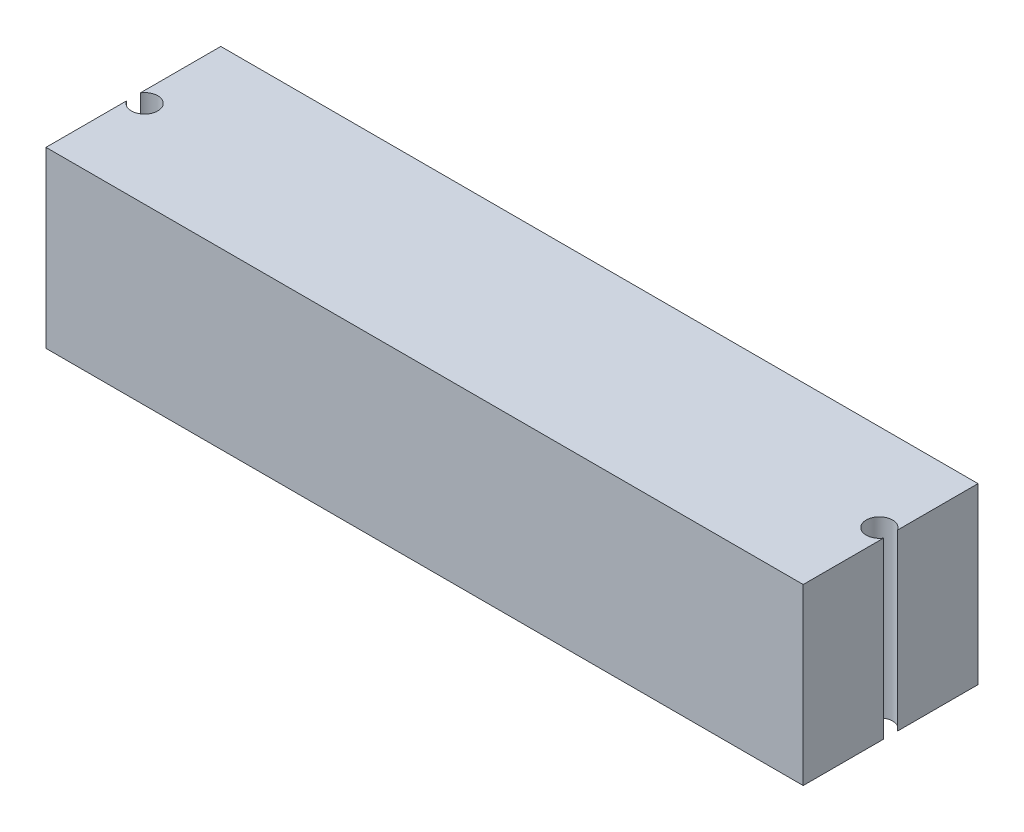
ISO-10303-21;
HEADER;
FILE_DESCRIPTION(('STEP AP214'),'2;1');
FILE_NAME('part.step','',(''),(''),'','','');
FILE_SCHEMA(('AUTOMOTIVE_DESIGN { 1 0 10303 214 1 1 1 1 }'));
ENDSEC;
DATA;
#1=APPLICATION_CONTEXT('core data for automotive mechanical design processes');
#2=APPLICATION_PROTOCOL_DEFINITION('international standard','automotive_design',2000,#1);
#3=PRODUCT_CONTEXT('',#1,'mechanical');
#4=PRODUCT('Part','Part','',(#3));
#5=PRODUCT_RELATED_PRODUCT_CATEGORY('part','',(#4));
#6=PRODUCT_DEFINITION_FORMATION('','',#4);
#7=PRODUCT_DEFINITION_CONTEXT('part definition',#1,'design');
#8=PRODUCT_DEFINITION('design','',#6,#7);
#9=PRODUCT_DEFINITION_SHAPE('','',#8);
#10=(LENGTH_UNIT() NAMED_UNIT(*) SI_UNIT(.MILLI.,.METRE.));
#11=(NAMED_UNIT(*) PLANE_ANGLE_UNIT() SI_UNIT($,.RADIAN.));
#12=(NAMED_UNIT(*) SI_UNIT($,.STERADIAN.) SOLID_ANGLE_UNIT());
#13=UNCERTAINTY_MEASURE_WITH_UNIT(LENGTH_MEASURE(1.E-05),#10,'distance_accuracy_value','');
#14=(GEOMETRIC_REPRESENTATION_CONTEXT(3) GLOBAL_UNCERTAINTY_ASSIGNED_CONTEXT((#13)) GLOBAL_UNIT_ASSIGNED_CONTEXT((#10,
#11,#12)) REPRESENTATION_CONTEXT('',''));
#15=CARTESIAN_POINT('',(0.,0.,0.));
#16=DIRECTION('',(0.,0.,1.));
#17=DIRECTION('',(1.,0.,0.));
#18=AXIS2_PLACEMENT_3D('',#15,#16,#17);
#19=CARTESIAN_POINT('',(-15.2432558748559,26.4,15.205418624234));
#20=DIRECTION('',(0.,0.,-1.));
#21=DIRECTION('',(-1.,0.,0.));
#22=AXIS2_PLACEMENT_3D('',#19,#20,#21);
#23=PLANE('',#22);
#24=DIRECTION('',(0.,1.,0.));
#25=VECTOR('',#24,1.);
#26=CARTESIAN_POINT('',(-14.7432558748559,26.4,15.205418624234));
#27=LINE('',#26,#25);
#28=CARTESIAN_POINT('',(-14.7432558748559,0.,15.205418624234));
#29=VERTEX_POINT('',#28);
#30=CARTESIAN_POINT('',(-14.7432558748559,26.4,15.205418624234));
#31=VERTEX_POINT('',#30);
#32=EDGE_CURVE('E124',#29,#31,#27,.T.);
#33=ORIENTED_EDGE('',*,*,#32,.F.);
#34=DIRECTION('',(1.,0.,0.));
#35=VECTOR('',#34,1.);
#36=CARTESIAN_POINT('',(-15.2432558748559,0.,15.205418624234));
#37=LINE('',#36,#35);
#38=CARTESIAN_POINT('',(100.056744125144,0.,15.205418624234));
#39=VERTEX_POINT('',#38);
#40=EDGE_CURVE('E130',#29,#39,#37,.T.);
#41=ORIENTED_EDGE('',*,*,#40,.T.);
#42=DIRECTION('',(0.,-1.,0.));
#43=VECTOR('',#42,1.);
#44=CARTESIAN_POINT('',(100.056744125144,0.,15.205418624234));
#45=LINE('',#44,#43);
#46=CARTESIAN_POINT('',(100.056744125144,26.4,15.205418624234));
#47=VERTEX_POINT('',#46);
#48=EDGE_CURVE('E169',#47,#39,#45,.T.);
#49=ORIENTED_EDGE('',*,*,#48,.F.);
#50=DIRECTION('',(1.,0.,0.));
#51=VECTOR('',#50,1.);
#52=CARTESIAN_POINT('',(-15.2432558748559,26.4,15.205418624234));
#53=LINE('',#52,#51);
#54=EDGE_CURVE('E127',#31,#47,#53,.T.);
#55=ORIENTED_EDGE('',*,*,#54,.F.);
#56=EDGE_LOOP('',(#33,#41,#49,#55));
#57=FACE_BOUND('',#56,.T.);
#58=ADVANCED_FACE('F41',(#57),#23,.F.);
#59=CARTESIAN_POINT('',(-15.2432558748559,26.4,-11.294581375766));
#60=DIRECTION('',(0.,0.,1.));
#61=DIRECTION('',(1.,0.,0.));
#62=AXIS2_PLACEMENT_3D('',#59,#60,#61);
#63=PLANE('',#62);
#64=DIRECTION('',(0.,-1.,0.));
#65=VECTOR('',#64,1.);
#66=CARTESIAN_POINT('',(-14.7432558748559,0.,-11.294581375766));
#67=LINE('',#66,#65);
#68=CARTESIAN_POINT('',(-14.7432558748559,26.4,-11.294581375766));
#69=VERTEX_POINT('',#68);
#70=CARTESIAN_POINT('',(-14.7432558748559,0.,-11.294581375766));
#71=VERTEX_POINT('',#70);
#72=EDGE_CURVE('E105',#69,#71,#67,.T.);
#73=ORIENTED_EDGE('',*,*,#72,.F.);
#74=DIRECTION('',(-1.,0.,0.));
#75=VECTOR('',#74,1.);
#76=CARTESIAN_POINT('',(-15.2432558748559,26.4,-11.294581375766));
#77=LINE('',#76,#75);
#78=CARTESIAN_POINT('',(100.056744125144,26.4,-11.294581375766));
#79=VERTEX_POINT('',#78);
#80=EDGE_CURVE('E129',#79,#69,#77,.T.);
#81=ORIENTED_EDGE('',*,*,#80,.F.);
#82=DIRECTION('',(0.,1.,0.));
#83=VECTOR('',#82,1.);
#84=CARTESIAN_POINT('',(100.056744125144,26.4,-11.294581375766));
#85=LINE('',#84,#83);
#86=CARTESIAN_POINT('',(100.056744125144,0.,-11.294581375766));
#87=VERTEX_POINT('',#86);
#88=EDGE_CURVE('E122',#87,#79,#85,.T.);
#89=ORIENTED_EDGE('',*,*,#88,.F.);
#90=DIRECTION('',(-1.,0.,0.));
#91=VECTOR('',#90,1.);
#92=CARTESIAN_POINT('',(-15.2432558748559,0.,-11.294581375766));
#93=LINE('',#92,#91);
#94=EDGE_CURVE('E119',#87,#71,#93,.T.);
#95=ORIENTED_EDGE('',*,*,#94,.T.);
#96=EDGE_LOOP('',(#73,#81,#89,#95));
#97=FACE_BOUND('',#96,.T.);
#98=ADVANCED_FACE('F123',(#97),#63,.F.);
#99=CARTESIAN_POINT('',(0.,0.,0.));
#100=DIRECTION('',(0.,1.,0.));
#101=DIRECTION('',(0.,0.,1.));
#102=AXIS2_PLACEMENT_3D('',#99,#100,#101);
#103=PLANE('',#102);
#104=DIRECTION('',(0.,0.,1.));
#105=VECTOR('',#104,1.);
#106=CARTESIAN_POINT('',(-14.7432558748559,0.,15.205418624234));
#107=LINE('',#106,#105);
#108=CARTESIAN_POINT('',(-14.7432558748559,0.,0.901853248948743));
#109=VERTEX_POINT('',#108);
#110=EDGE_CURVE('E65',#71,#109,#107,.T.);
#111=ORIENTED_EDGE('',*,*,#110,.F.);
#112=ORIENTED_EDGE('',*,*,#94,.F.);
#113=DIRECTION('',(0.,0.,-1.));
#114=VECTOR('',#113,1.);
#115=CARTESIAN_POINT('',(100.056744125144,0.,-11.294581375766));
#116=LINE('',#115,#114);
#117=CARTESIAN_POINT('',(100.056744125144,0.,0.90185324894876));
#118=VERTEX_POINT('',#117);
#119=EDGE_CURVE('E170',#118,#87,#116,.T.);
#120=ORIENTED_EDGE('',*,*,#119,.F.);
#121=CARTESIAN_POINT('',(98.3567441251441,0.,1.95541862423402));
#122=DIRECTION('',(0.,1.,0.));
#123=DIRECTION('',(0.,0.,1.));
#124=AXIS2_PLACEMENT_3D('',#121,#122,#123);
#125=CIRCLE('',#124,2.);
#126=CARTESIAN_POINT('',(100.056744125144,0.,3.00898399951927));
#127=VERTEX_POINT('',#126);
#128=EDGE_CURVE('E151',#118,#127,#125,.T.);
#129=ORIENTED_EDGE('',*,*,#128,.T.);
#130=EDGE_CURVE('E164',#39,#127,#116,.T.);
#131=ORIENTED_EDGE('',*,*,#130,.F.);
#132=ORIENTED_EDGE('',*,*,#40,.F.);
#133=CARTESIAN_POINT('',(-14.7432558748559,0.,3.00898399951929));
#134=VERTEX_POINT('',#133);
#135=EDGE_CURVE('E109',#134,#29,#107,.T.);
#136=ORIENTED_EDGE('',*,*,#135,.F.);
#137=CARTESIAN_POINT('',(-13.0432558748559,0.,1.95541862423402));
#138=DIRECTION('',(0.,1.,0.));
#139=DIRECTION('',(0.,0.,1.));
#140=AXIS2_PLACEMENT_3D('',#137,#138,#139);
#141=CIRCLE('',#140,2.);
#142=EDGE_CURVE('E118',#134,#109,#141,.T.);
#143=ORIENTED_EDGE('',*,*,#142,.T.);
#144=EDGE_LOOP('',(#111,#112,#120,#129,#131,#132,#136,#143));
#145=FACE_BOUND('',#144,.T.);
#146=ADVANCED_FACE('F113',(#145),#103,.F.);
#147=CARTESIAN_POINT('',(0.,26.4,0.));
#148=DIRECTION('',(0.,1.,0.));
#149=DIRECTION('',(0.,0.,1.));
#150=AXIS2_PLACEMENT_3D('',#147,#148,#149);
#151=PLANE('',#150);
#152=DIRECTION('',(0.,0.,-1.));
#153=VECTOR('',#152,1.);
#154=CARTESIAN_POINT('',(-14.7432558748559,26.4,-11.294581375766));
#155=LINE('',#154,#153);
#156=CARTESIAN_POINT('',(-14.7432558748559,26.4,3.00898399951929));
#157=VERTEX_POINT('',#156);
#158=EDGE_CURVE('E54',#31,#157,#155,.T.);
#159=ORIENTED_EDGE('',*,*,#158,.F.);
#160=ORIENTED_EDGE('',*,*,#54,.T.);
#161=DIRECTION('',(0.,0.,1.));
#162=VECTOR('',#161,1.);
#163=CARTESIAN_POINT('',(100.056744125144,26.4,15.205418624234));
#164=LINE('',#163,#162);
#165=CARTESIAN_POINT('',(100.056744125144,26.4,3.00898399951927));
#166=VERTEX_POINT('',#165);
#167=EDGE_CURVE('E161',#166,#47,#164,.T.);
#168=ORIENTED_EDGE('',*,*,#167,.F.);
#169=CARTESIAN_POINT('',(98.3567441251441,26.4,1.95541862423402));
#170=DIRECTION('',(0.,1.,0.));
#171=DIRECTION('',(0.,0.,1.));
#172=AXIS2_PLACEMENT_3D('',#169,#170,#171);
#173=CIRCLE('',#172,2.);
#174=CARTESIAN_POINT('',(100.056744125144,26.4,0.901853248948761));
#175=VERTEX_POINT('',#174);
#176=EDGE_CURVE('E150',#175,#166,#173,.T.);
#177=ORIENTED_EDGE('',*,*,#176,.F.);
#178=EDGE_CURVE('E156',#79,#175,#164,.T.);
#179=ORIENTED_EDGE('',*,*,#178,.F.);
#180=ORIENTED_EDGE('',*,*,#80,.T.);
#181=CARTESIAN_POINT('',(-14.7432558748559,26.4,0.901853248948743));
#182=VERTEX_POINT('',#181);
#183=EDGE_CURVE('E104',#182,#69,#155,.T.);
#184=ORIENTED_EDGE('',*,*,#183,.F.);
#185=CARTESIAN_POINT('',(-13.0432558748559,26.4,1.95541862423402));
#186=DIRECTION('',(0.,1.,0.));
#187=DIRECTION('',(0.,0.,1.));
#188=AXIS2_PLACEMENT_3D('',#185,#186,#187);
#189=CIRCLE('',#188,2.);
#190=EDGE_CURVE('E141',#157,#182,#189,.T.);
#191=ORIENTED_EDGE('',*,*,#190,.F.);
#192=EDGE_LOOP('',(#159,#160,#168,#177,#179,#180,#184,#191));
#193=FACE_BOUND('',#192,.T.);
#194=ADVANCED_FACE('F144',(#193),#151,.T.);
#195=CARTESIAN_POINT('',(98.3567441251441,0.,1.95541862423402));
#196=DIRECTION('',(0.,1.,0.));
#197=DIRECTION('',(0.,0.,1.));
#198=AXIS2_PLACEMENT_3D('',#195,#196,#197);
#199=CYLINDRICAL_SURFACE('',#198,2.);
#200=ORIENTED_EDGE('',*,*,#176,.T.);
#201=DIRECTION('',(0.,1.,0.));
#202=VECTOR('',#201,1.);
#203=CARTESIAN_POINT('',(100.056744125144,0.,3.00898399951927));
#204=LINE('',#203,#202);
#205=EDGE_CURVE('E136',#166,#127,#204,.F.);
#206=ORIENTED_EDGE('',*,*,#205,.T.);
#207=ORIENTED_EDGE('',*,*,#128,.F.);
#208=DIRECTION('',(0.,1.,0.));
#209=VECTOR('',#208,1.);
#210=CARTESIAN_POINT('',(100.056744125144,0.,0.901853248948761));
#211=LINE('',#210,#209);
#212=EDGE_CURVE('E131',#118,#175,#211,.T.);
#213=ORIENTED_EDGE('',*,*,#212,.T.);
#214=EDGE_LOOP('',(#200,#206,#207,#213));
#215=FACE_BOUND('',#214,.T.);
#216=ADVANCED_FACE('F185',(#215),#199,.F.);
#217=CARTESIAN_POINT('',(-13.0432558748559,0.,1.95541862423402));
#218=DIRECTION('',(0.,1.,0.));
#219=DIRECTION('',(0.,0.,1.));
#220=AXIS2_PLACEMENT_3D('',#217,#218,#219);
#221=CYLINDRICAL_SURFACE('',#220,2.);
#222=ORIENTED_EDGE('',*,*,#190,.T.);
#223=DIRECTION('',(0.,1.,0.));
#224=VECTOR('',#223,1.);
#225=CARTESIAN_POINT('',(-14.7432558748559,0.,0.901853248948743));
#226=LINE('',#225,#224);
#227=EDGE_CURVE('E11',#182,#109,#226,.F.);
#228=ORIENTED_EDGE('',*,*,#227,.T.);
#229=ORIENTED_EDGE('',*,*,#142,.F.);
#230=DIRECTION('',(0.,1.,0.));
#231=VECTOR('',#230,1.);
#232=CARTESIAN_POINT('',(-14.7432558748559,0.,3.00898399951929));
#233=LINE('',#232,#231);
#234=EDGE_CURVE('E48',#134,#157,#233,.T.);
#235=ORIENTED_EDGE('',*,*,#234,.T.);
#236=EDGE_LOOP('',(#222,#228,#229,#235));
#237=FACE_BOUND('',#236,.T.);
#238=ADVANCED_FACE('F142',(#237),#221,.F.);
#239=CARTESIAN_POINT('',(100.056744125144,0.,0.));
#240=DIRECTION('',(-1.,0.,0.));
#241=DIRECTION('',(0.,0.,1.));
#242=AXIS2_PLACEMENT_3D('',#239,#240,#241);
#243=PLANE('',#242);
#244=ORIENTED_EDGE('',*,*,#119,.T.);
#245=ORIENTED_EDGE('',*,*,#88,.T.);
#246=ORIENTED_EDGE('',*,*,#178,.T.);
#247=ORIENTED_EDGE('',*,*,#212,.F.);
#248=EDGE_LOOP('',(#244,#245,#246,#247));
#249=FACE_BOUND('',#248,.T.);
#250=ADVANCED_FACE('F181',(#249),#243,.F.);
#251=ORIENTED_EDGE('',*,*,#167,.T.);
#252=ORIENTED_EDGE('',*,*,#48,.T.);
#253=ORIENTED_EDGE('',*,*,#130,.T.);
#254=ORIENTED_EDGE('',*,*,#205,.F.);
#255=EDGE_LOOP('',(#251,#252,#253,#254));
#256=FACE_BOUND('',#255,.T.);
#257=ADVANCED_FACE('F177',(#256),#243,.F.);
#258=CARTESIAN_POINT('',(-14.7432558748559,0.,0.));
#259=DIRECTION('',(1.,0.,0.));
#260=DIRECTION('',(0.,0.,-1.));
#261=AXIS2_PLACEMENT_3D('',#258,#259,#260);
#262=PLANE('',#261);
#263=ORIENTED_EDGE('',*,*,#135,.T.);
#264=ORIENTED_EDGE('',*,*,#32,.T.);
#265=ORIENTED_EDGE('',*,*,#158,.T.);
#266=ORIENTED_EDGE('',*,*,#234,.F.);
#267=EDGE_LOOP('',(#263,#264,#265,#266));
#268=FACE_BOUND('',#267,.T.);
#269=ADVANCED_FACE('F175',(#268),#262,.F.);
#270=ORIENTED_EDGE('',*,*,#183,.T.);
#271=ORIENTED_EDGE('',*,*,#72,.T.);
#272=ORIENTED_EDGE('',*,*,#110,.T.);
#273=ORIENTED_EDGE('',*,*,#227,.F.);
#274=EDGE_LOOP('',(#270,#271,#272,#273));
#275=FACE_BOUND('',#274,.T.);
#276=ADVANCED_FACE('F103',(#275),#262,.F.);
#277=CLOSED_SHELL('',(#58,#98,#146,#194,#216,#238,#250,#257,#269,#276));
#278=MANIFOLD_SOLID_BREP('B2',#277);
#279=ADVANCED_BREP_SHAPE_REPRESENTATION('',(#18,#278),#14);
#280=SHAPE_DEFINITION_REPRESENTATION(#9,#279);
ENDSEC;
END-ISO-10303-21;
